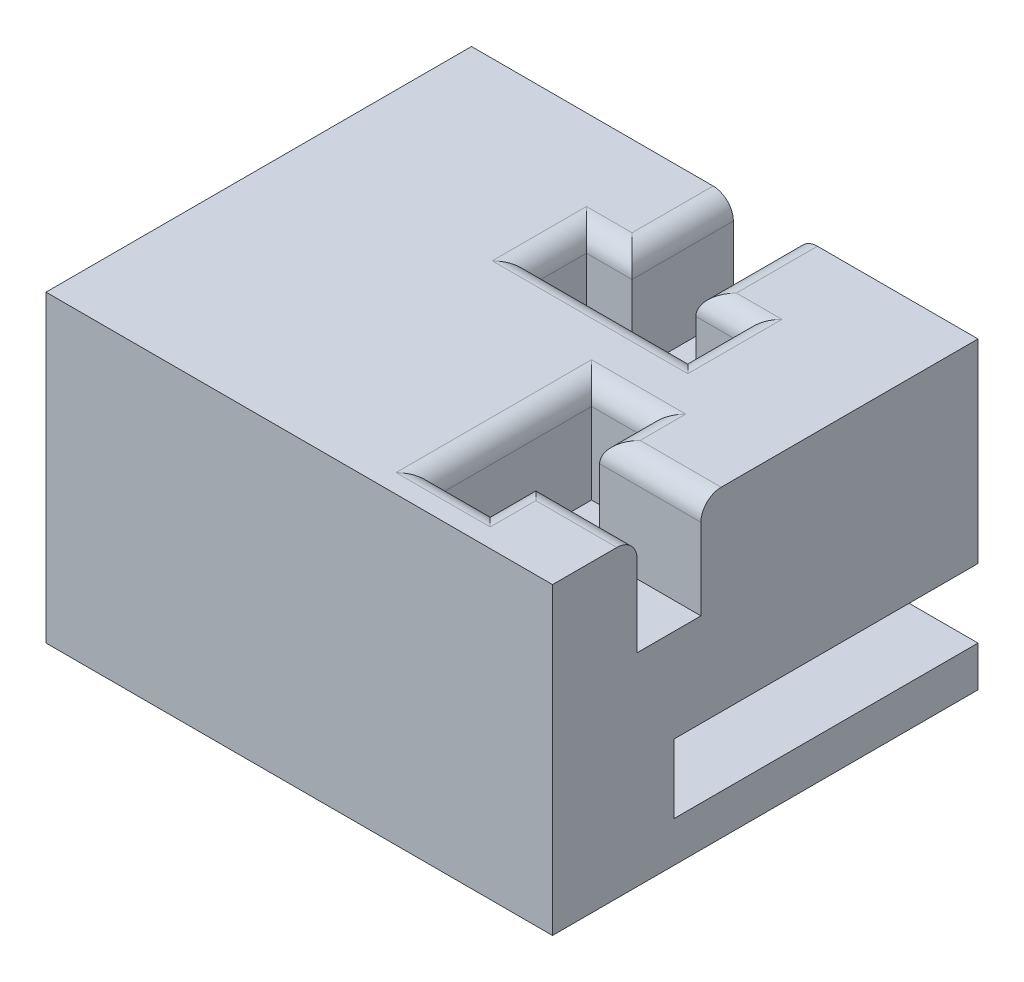
ISO-10303-21;
HEADER;
FILE_DESCRIPTION(('STEP AP214'),'2;1');
FILE_NAME('part.step','',(''),(''),'','','');
FILE_SCHEMA(('AUTOMOTIVE_DESIGN { 1 0 10303 214 1 1 1 1 }'));
ENDSEC;
DATA;
#1=APPLICATION_CONTEXT('core data for automotive mechanical design processes');
#2=APPLICATION_PROTOCOL_DEFINITION('international standard','automotive_design',2000,#1);
#3=PRODUCT_CONTEXT('',#1,'mechanical');
#4=PRODUCT('Part','Part','',(#3));
#5=PRODUCT_RELATED_PRODUCT_CATEGORY('part','',(#4));
#6=PRODUCT_DEFINITION_FORMATION('','',#4);
#7=PRODUCT_DEFINITION_CONTEXT('part definition',#1,'design');
#8=PRODUCT_DEFINITION('design','',#6,#7);
#9=PRODUCT_DEFINITION_SHAPE('','',#8);
#10=(LENGTH_UNIT() NAMED_UNIT(*) SI_UNIT(.MILLI.,.METRE.));
#11=(NAMED_UNIT(*) PLANE_ANGLE_UNIT() SI_UNIT($,.RADIAN.));
#12=(NAMED_UNIT(*) SI_UNIT($,.STERADIAN.) SOLID_ANGLE_UNIT());
#13=UNCERTAINTY_MEASURE_WITH_UNIT(LENGTH_MEASURE(1.E-05),#10,'distance_accuracy_value','');
#14=(GEOMETRIC_REPRESENTATION_CONTEXT(3) GLOBAL_UNCERTAINTY_ASSIGNED_CONTEXT((#13)) GLOBAL_UNIT_ASSIGNED_CONTEXT((#10,
#11,#12)) REPRESENTATION_CONTEXT('',''));
#15=CARTESIAN_POINT('',(0.,0.,0.));
#16=DIRECTION('',(0.,0.,1.));
#17=DIRECTION('',(1.,0.,0.));
#18=AXIS2_PLACEMENT_3D('',#15,#16,#17);
#19=CARTESIAN_POINT('',(-57.5,15.,-10.5));
#20=DIRECTION('',(1.,0.,0.));
#21=DIRECTION('',(0.,0.,1.));
#22=AXIS2_PLACEMENT_3D('',#19,#20,#21);
#23=PLANE('',#22);
#24=DIRECTION('',(0.,0.,-1.));
#25=VECTOR('',#24,1.);
#26=CARTESIAN_POINT('',(-57.5,0.,-10.5));
#27=LINE('',#26,#25);
#28=CARTESIAN_POINT('',(-57.5,0.,10.5));
#29=VERTEX_POINT('',#28);
#30=CARTESIAN_POINT('',(-57.5,0.,-10.5));
#31=VERTEX_POINT('',#30);
#32=EDGE_CURVE('E380',#29,#31,#27,.T.);
#33=ORIENTED_EDGE('',*,*,#32,.F.);
#34=DIRECTION('',(0.,-1.,0.));
#35=VECTOR('',#34,1.);
#36=CARTESIAN_POINT('',(-57.5,15.,10.5));
#37=LINE('',#36,#35);
#38=CARTESIAN_POINT('',(-57.5,15.,10.5));
#39=VERTEX_POINT('',#38);
#40=EDGE_CURVE('E395',#39,#29,#37,.T.);
#41=ORIENTED_EDGE('',*,*,#40,.F.);
#42=DIRECTION('',(0.,0.,-1.));
#43=VECTOR('',#42,1.);
#44=CARTESIAN_POINT('',(-57.5,15.,-10.5));
#45=LINE('',#44,#43);
#46=CARTESIAN_POINT('',(-57.5,15.,-10.5));
#47=VERTEX_POINT('',#46);
#48=EDGE_CURVE('E381',#39,#47,#45,.T.);
#49=ORIENTED_EDGE('',*,*,#48,.T.);
#50=DIRECTION('',(0.,-1.,0.));
#51=VECTOR('',#50,1.);
#52=CARTESIAN_POINT('',(-57.5,15.,-10.5));
#53=LINE('',#52,#51);
#54=EDGE_CURVE('E414',#47,#31,#53,.T.);
#55=ORIENTED_EDGE('',*,*,#54,.T.);
#56=EDGE_LOOP('',(#33,#41,#49,#55));
#57=FACE_BOUND('',#56,.T.);
#58=ADVANCED_FACE('F41',(#57),#23,.F.);
#59=CARTESIAN_POINT('',(-32.5,15.,-10.5));
#60=DIRECTION('',(0.,0.,1.));
#61=DIRECTION('',(-1.,0.,0.));
#62=AXIS2_PLACEMENT_3D('',#59,#60,#61);
#63=PLANE('',#62);
#64=DIRECTION('',(1.,0.,0.));
#65=VECTOR('',#64,1.);
#66=CARTESIAN_POINT('',(-32.5,15.,-10.5));
#67=LINE('',#66,#65);
#68=CARTESIAN_POINT('',(-40.425,15.,-10.5));
#69=VERTEX_POINT('',#68);
#70=CARTESIAN_POINT('',(-32.5,15.,-10.5));
#71=VERTEX_POINT('',#70);
#72=EDGE_CURVE('E384',#69,#71,#67,.T.);
#73=ORIENTED_EDGE('',*,*,#72,.T.);
#74=DIRECTION('',(0.,-1.,0.));
#75=VECTOR('',#74,1.);
#76=CARTESIAN_POINT('',(-32.5,15.,-10.5));
#77=LINE('',#76,#75);
#78=CARTESIAN_POINT('',(-32.5,5.4,-10.5));
#79=VERTEX_POINT('',#78);
#80=EDGE_CURVE('E411',#71,#79,#77,.T.);
#81=ORIENTED_EDGE('',*,*,#80,.T.);
#82=DIRECTION('',(1.,0.,0.));
#83=VECTOR('',#82,1.);
#84=CARTESIAN_POINT('',(-72.8805071437843,5.4,-10.5));
#85=LINE('',#84,#83);
#86=CARTESIAN_POINT('',(-55.1,5.4,-10.5));
#87=VERTEX_POINT('',#86);
#88=EDGE_CURVE('E356',#87,#79,#85,.T.);
#89=ORIENTED_EDGE('',*,*,#88,.F.);
#90=DIRECTION('',(0.,1.,0.));
#91=VECTOR('',#90,1.);
#92=CARTESIAN_POINT('',(-55.1,2.,-10.5));
#93=LINE('',#92,#91);
#94=CARTESIAN_POINT('',(-55.1,2.,-10.5));
#95=VERTEX_POINT('',#94);
#96=EDGE_CURVE('E359',#95,#87,#93,.T.);
#97=ORIENTED_EDGE('',*,*,#96,.F.);
#98=DIRECTION('',(1.,0.,0.));
#99=VECTOR('',#98,1.);
#100=CARTESIAN_POINT('',(-72.8805071437843,2.,-10.5));
#101=LINE('',#100,#99);
#102=CARTESIAN_POINT('',(-32.5,2.,-10.5));
#103=VERTEX_POINT('',#102);
#104=EDGE_CURVE('E370',#95,#103,#101,.T.);
#105=ORIENTED_EDGE('',*,*,#104,.T.);
#106=CARTESIAN_POINT('',(-32.5,0.,-10.5));
#107=VERTEX_POINT('',#106);
#108=EDGE_CURVE('E410',#103,#107,#77,.T.);
#109=ORIENTED_EDGE('',*,*,#108,.T.);
#110=DIRECTION('',(1.,0.,0.));
#111=VECTOR('',#110,1.);
#112=CARTESIAN_POINT('',(-32.5,0.,-10.5));
#113=LINE('',#112,#111);
#114=EDGE_CURVE('E398',#31,#107,#113,.T.);
#115=ORIENTED_EDGE('',*,*,#114,.F.);
#116=ORIENTED_EDGE('',*,*,#54,.F.);
#117=CARTESIAN_POINT('',(-45.575,15.,-10.5));
#118=VERTEX_POINT('',#117);
#119=EDGE_CURVE('E386',#47,#118,#67,.T.);
#120=ORIENTED_EDGE('',*,*,#119,.T.);
#121=CARTESIAN_POINT('',(-45.575,14.,-10.5));
#122=DIRECTION('',(0.,0.,-1.));
#123=DIRECTION('',(-1.,0.,0.));
#124=AXIS2_PLACEMENT_3D('',#121,#122,#123);
#125=CIRCLE('',#124,1.);
#126=CARTESIAN_POINT('',(-44.575,14.,-10.5));
#127=VERTEX_POINT('',#126);
#128=EDGE_CURVE('E458',#127,#118,#125,.F.);
#129=ORIENTED_EDGE('',*,*,#128,.F.);
#130=DIRECTION('',(0.,1.,0.));
#131=VECTOR('',#130,1.);
#132=CARTESIAN_POINT('',(-44.575,10.,-10.5));
#133=LINE('',#132,#131);
#134=CARTESIAN_POINT('',(-44.575,10.,-10.5));
#135=VERTEX_POINT('',#134);
#136=EDGE_CURVE('E336',#135,#127,#133,.T.);
#137=ORIENTED_EDGE('',*,*,#136,.F.);
#138=DIRECTION('',(1.,0.,0.));
#139=VECTOR('',#138,1.);
#140=CARTESIAN_POINT('',(-44.575,10.,-10.5));
#141=LINE('',#140,#139);
#142=CARTESIAN_POINT('',(-41.425,10.,-10.5));
#143=VERTEX_POINT('',#142);
#144=EDGE_CURVE('E279',#135,#143,#141,.T.);
#145=ORIENTED_EDGE('',*,*,#144,.T.);
#146=DIRECTION('',(0.,1.,0.));
#147=VECTOR('',#146,1.);
#148=CARTESIAN_POINT('',(-41.425,10.,-10.5));
#149=LINE('',#148,#147);
#150=CARTESIAN_POINT('',(-41.425,14.,-10.5));
#151=VERTEX_POINT('',#150);
#152=EDGE_CURVE('E314',#143,#151,#149,.T.);
#153=ORIENTED_EDGE('',*,*,#152,.T.);
#154=CARTESIAN_POINT('',(-40.425,14.,-10.5));
#155=DIRECTION('',(0.,0.,-1.));
#156=DIRECTION('',(-1.,0.,0.));
#157=AXIS2_PLACEMENT_3D('',#154,#155,#156);
#158=CIRCLE('',#157,1.);
#159=EDGE_CURVE('E461',#69,#151,#158,.F.);
#160=ORIENTED_EDGE('',*,*,#159,.F.);
#161=EDGE_LOOP('',(#73,#81,#89,#97,#105,#109,#115,#116,#120,#129,#137,#145,#153,#160));
#162=FACE_BOUND('',#161,.T.);
#163=ADVANCED_FACE('F569',(#162),#63,.F.);
#164=CARTESIAN_POINT('',(-32.5,15.,-10.5));
#165=DIRECTION('',(-1.,0.,0.));
#166=DIRECTION('',(0.,0.,-1.));
#167=AXIS2_PLACEMENT_3D('',#164,#165,#166);
#168=PLANE('',#167);
#169=DIRECTION('',(0.,1.,0.));
#170=VECTOR('',#169,1.);
#171=CARTESIAN_POINT('',(-32.5,10.,3.175));
#172=LINE('',#171,#170);
#173=CARTESIAN_POINT('',(-32.5,10.,3.175));
#174=VERTEX_POINT('',#173);
#175=CARTESIAN_POINT('',(-32.5,14.,3.175));
#176=VERTEX_POINT('',#175);
#177=EDGE_CURVE('E310',#174,#176,#172,.T.);
#178=ORIENTED_EDGE('',*,*,#177,.F.);
#179=DIRECTION('',(0.,0.,1.));
#180=VECTOR('',#179,1.);
#181=CARTESIAN_POINT('',(-32.5,10.,6.325));
#182=LINE('',#181,#180);
#183=CARTESIAN_POINT('',(-32.5,10.,6.325));
#184=VERTEX_POINT('',#183);
#185=EDGE_CURVE('E286',#174,#184,#182,.T.);
#186=ORIENTED_EDGE('',*,*,#185,.T.);
#187=DIRECTION('',(0.,1.,0.));
#188=VECTOR('',#187,1.);
#189=CARTESIAN_POINT('',(-32.5,10.,6.325));
#190=LINE('',#189,#188);
#191=CARTESIAN_POINT('',(-32.5,14.,6.325));
#192=VERTEX_POINT('',#191);
#193=EDGE_CURVE('E307',#184,#192,#190,.T.);
#194=ORIENTED_EDGE('',*,*,#193,.T.);
#195=CARTESIAN_POINT('',(-32.5,14.,7.325));
#196=DIRECTION('',(1.,0.,0.));
#197=DIRECTION('',(0.,0.,-1.));
#198=AXIS2_PLACEMENT_3D('',#195,#196,#197);
#199=CIRCLE('',#198,1.);
#200=CARTESIAN_POINT('',(-32.5,15.,7.32499999999999));
#201=VERTEX_POINT('',#200);
#202=EDGE_CURVE('E483',#201,#192,#199,.F.);
#203=ORIENTED_EDGE('',*,*,#202,.F.);
#204=DIRECTION('',(0.,0.,1.));
#205=VECTOR('',#204,1.);
#206=CARTESIAN_POINT('',(-32.5,15.,-10.5));
#207=LINE('',#206,#205);
#208=CARTESIAN_POINT('',(-32.5,15.,10.5));
#209=VERTEX_POINT('',#208);
#210=EDGE_CURVE('E389',#201,#209,#207,.T.);
#211=ORIENTED_EDGE('',*,*,#210,.T.);
#212=DIRECTION('',(0.,-1.,0.));
#213=VECTOR('',#212,1.);
#214=CARTESIAN_POINT('',(-32.5,15.,10.5));
#215=LINE('',#214,#213);
#216=CARTESIAN_POINT('',(-32.5,0.,10.5));
#217=VERTEX_POINT('',#216);
#218=EDGE_CURVE('E407',#209,#217,#215,.T.);
#219=ORIENTED_EDGE('',*,*,#218,.T.);
#220=DIRECTION('',(0.,0.,1.));
#221=VECTOR('',#220,1.);
#222=CARTESIAN_POINT('',(-32.5,0.,-10.5));
#223=LINE('',#222,#221);
#224=EDGE_CURVE('E401',#107,#217,#223,.T.);
#225=ORIENTED_EDGE('',*,*,#224,.F.);
#226=ORIENTED_EDGE('',*,*,#108,.F.);
#227=DIRECTION('',(0.,0.,1.));
#228=VECTOR('',#227,1.);
#229=CARTESIAN_POINT('',(-32.5,2.,-10.5));
#230=LINE('',#229,#228);
#231=CARTESIAN_POINT('',(-32.5,2.,4.5));
#232=VERTEX_POINT('',#231);
#233=EDGE_CURVE('E297',#103,#232,#230,.T.);
#234=ORIENTED_EDGE('',*,*,#233,.T.);
#235=DIRECTION('',(0.,1.,0.));
#236=VECTOR('',#235,1.);
#237=CARTESIAN_POINT('',(-32.5,2.,4.5));
#238=LINE('',#237,#236);
#239=CARTESIAN_POINT('',(-32.5,5.4,4.5));
#240=VERTEX_POINT('',#239);
#241=EDGE_CURVE('E365',#232,#240,#238,.T.);
#242=ORIENTED_EDGE('',*,*,#241,.T.);
#243=DIRECTION('',(0.,0.,-1.));
#244=VECTOR('',#243,1.);
#245=CARTESIAN_POINT('',(-32.5,5.4,-10.5));
#246=LINE('',#245,#244);
#247=EDGE_CURVE('E368',#240,#79,#246,.T.);
#248=ORIENTED_EDGE('',*,*,#247,.T.);
#249=ORIENTED_EDGE('',*,*,#80,.F.);
#250=CARTESIAN_POINT('',(-32.5,15.,2.175));
#251=VERTEX_POINT('',#250);
#252=EDGE_CURVE('E390',#71,#251,#207,.T.);
#253=ORIENTED_EDGE('',*,*,#252,.T.);
#254=CARTESIAN_POINT('',(-32.5,14.,2.175));
#255=DIRECTION('',(1.,0.,0.));
#256=DIRECTION('',(0.,0.,-1.));
#257=AXIS2_PLACEMENT_3D('',#254,#255,#256);
#258=CIRCLE('',#257,1.);
#259=EDGE_CURVE('E486',#176,#251,#258,.F.);
#260=ORIENTED_EDGE('',*,*,#259,.F.);
#261=EDGE_LOOP('',(#178,#186,#194,#203,#211,#219,#225,#226,#234,#242,#248,#249,#253,#260));
#262=FACE_BOUND('',#261,.T.);
#263=ADVANCED_FACE('F532',(#262),#168,.F.);
#264=CARTESIAN_POINT('',(-32.5,15.,10.5));
#265=DIRECTION('',(0.,0.,-1.));
#266=DIRECTION('',(1.,0.,0.));
#267=AXIS2_PLACEMENT_3D('',#264,#265,#266);
#268=PLANE('',#267);
#269=DIRECTION('',(-1.,0.,0.));
#270=VECTOR('',#269,1.);
#271=CARTESIAN_POINT('',(-32.5,0.,10.5));
#272=LINE('',#271,#270);
#273=EDGE_CURVE('E385',#217,#29,#272,.T.);
#274=ORIENTED_EDGE('',*,*,#273,.F.);
#275=ORIENTED_EDGE('',*,*,#218,.F.);
#276=DIRECTION('',(-1.,0.,0.));
#277=VECTOR('',#276,1.);
#278=CARTESIAN_POINT('',(-32.5,15.,10.5));
#279=LINE('',#278,#277);
#280=EDGE_CURVE('E393',#209,#39,#279,.T.);
#281=ORIENTED_EDGE('',*,*,#280,.T.);
#282=ORIENTED_EDGE('',*,*,#40,.T.);
#283=EDGE_LOOP('',(#274,#275,#281,#282));
#284=FACE_BOUND('',#283,.T.);
#285=ADVANCED_FACE('F603',(#284),#268,.F.);
#286=CARTESIAN_POINT('',(-45.,15.,0.));
#287=DIRECTION('',(0.,1.,0.));
#288=DIRECTION('',(0.,0.,1.));
#289=AXIS2_PLACEMENT_3D('',#286,#287,#288);
#290=PLANE('',#289);
#291=DIRECTION('',(1.,0.,0.));
#292=VECTOR('',#291,1.);
#293=CARTESIAN_POINT('',(-41.425,15.,-6.5));
#294=LINE('',#293,#292);
#295=CARTESIAN_POINT('',(-38.175,15.,-6.5));
#296=VERTEX_POINT('',#295);
#297=CARTESIAN_POINT('',(-40.425,15.,-6.5));
#298=VERTEX_POINT('',#297);
#299=EDGE_CURVE('E453',#296,#298,#294,.F.);
#300=ORIENTED_EDGE('',*,*,#299,.F.);
#301=DIRECTION('',(0.,0.,1.));
#302=VECTOR('',#301,1.);
#303=CARTESIAN_POINT('',(-38.175,15.,-5.5));
#304=LINE('',#303,#302);
#305=CARTESIAN_POINT('',(-38.175,15.,-1.85));
#306=VERTEX_POINT('',#305);
#307=EDGE_CURVE('E450',#306,#296,#304,.F.);
#308=ORIENTED_EDGE('',*,*,#307,.F.);
#309=DIRECTION('',(-1.,0.,0.));
#310=VECTOR('',#309,1.);
#311=CARTESIAN_POINT('',(-39.175,15.,-1.85));
#312=LINE('',#311,#310);
#313=CARTESIAN_POINT('',(-47.825,15.,-1.85));
#314=VERTEX_POINT('',#313);
#315=EDGE_CURVE('E447',#314,#306,#312,.F.);
#316=ORIENTED_EDGE('',*,*,#315,.F.);
#317=DIRECTION('',(0.,0.,-1.));
#318=VECTOR('',#317,1.);
#319=CARTESIAN_POINT('',(-47.825,15.,-2.85));
#320=LINE('',#319,#318);
#321=CARTESIAN_POINT('',(-47.825,15.,-6.5));
#322=VERTEX_POINT('',#321);
#323=EDGE_CURVE('E444',#322,#314,#320,.F.);
#324=ORIENTED_EDGE('',*,*,#323,.F.);
#325=DIRECTION('',(1.,0.,0.));
#326=VECTOR('',#325,1.);
#327=CARTESIAN_POINT('',(-46.825,15.,-6.5));
#328=LINE('',#327,#326);
#329=CARTESIAN_POINT('',(-45.575,15.,-6.5));
#330=VERTEX_POINT('',#329);
#331=EDGE_CURVE('E441',#330,#322,#328,.F.);
#332=ORIENTED_EDGE('',*,*,#331,.F.);
#333=DIRECTION('',(0.,0.,-1.));
#334=VECTOR('',#333,1.);
#335=CARTESIAN_POINT('',(-45.575,15.,-5.5));
#336=LINE('',#335,#334);
#337=EDGE_CURVE('E438',#118,#330,#336,.F.);
#338=ORIENTED_EDGE('',*,*,#337,.F.);
#339=ORIENTED_EDGE('',*,*,#119,.F.);
#340=ORIENTED_EDGE('',*,*,#48,.F.);
#341=ORIENTED_EDGE('',*,*,#280,.F.);
#342=ORIENTED_EDGE('',*,*,#210,.F.);
#343=DIRECTION('',(-1.,0.,0.));
#344=VECTOR('',#343,1.);
#345=CARTESIAN_POINT('',(-32.5,15.,7.325));
#346=LINE('',#345,#344);
#347=CARTESIAN_POINT('',(-36.5,15.,7.325));
#348=VERTEX_POINT('',#347);
#349=EDGE_CURVE('E420',#348,#201,#346,.F.);
#350=ORIENTED_EDGE('',*,*,#349,.F.);
#351=DIRECTION('',(0.,0.,1.));
#352=VECTOR('',#351,1.);
#353=CARTESIAN_POINT('',(-36.5,15.,6.325));
#354=LINE('',#353,#352);
#355=CARTESIAN_POINT('',(-36.5,15.,9.575));
#356=VERTEX_POINT('',#355);
#357=EDGE_CURVE('E422',#356,#348,#354,.F.);
#358=ORIENTED_EDGE('',*,*,#357,.F.);
#359=DIRECTION('',(-1.,0.,0.));
#360=VECTOR('',#359,1.);
#361=CARTESIAN_POINT('',(-37.5,15.,9.575));
#362=LINE('',#361,#360);
#363=CARTESIAN_POINT('',(-41.15,15.,9.575));
#364=VERTEX_POINT('',#363);
#365=EDGE_CURVE('E424',#364,#356,#362,.F.);
#366=ORIENTED_EDGE('',*,*,#365,.F.);
#367=DIRECTION('',(0.,0.,-1.));
#368=VECTOR('',#367,1.);
#369=CARTESIAN_POINT('',(-41.15,15.,8.575));
#370=LINE('',#369,#368);
#371=CARTESIAN_POINT('',(-41.15,15.,-0.0749999999999995));
#372=VERTEX_POINT('',#371);
#373=EDGE_CURVE('E426',#372,#364,#370,.F.);
#374=ORIENTED_EDGE('',*,*,#373,.F.);
#375=DIRECTION('',(1.,0.,0.));
#376=VECTOR('',#375,1.);
#377=CARTESIAN_POINT('',(-40.15,15.,-0.0749999999999995));
#378=LINE('',#377,#376);
#379=CARTESIAN_POINT('',(-36.5,15.,-0.0749999999999995));
#380=VERTEX_POINT('',#379);
#381=EDGE_CURVE('E429',#380,#372,#378,.F.);
#382=ORIENTED_EDGE('',*,*,#381,.F.);
#383=DIRECTION('',(0.,0.,1.));
#384=VECTOR('',#383,1.);
#385=CARTESIAN_POINT('',(-36.5,15.,0.925));
#386=LINE('',#385,#384);
#387=CARTESIAN_POINT('',(-36.5,15.,2.175));
#388=VERTEX_POINT('',#387);
#389=EDGE_CURVE('E432',#388,#380,#386,.F.);
#390=ORIENTED_EDGE('',*,*,#389,.F.);
#391=DIRECTION('',(1.,0.,0.));
#392=VECTOR('',#391,1.);
#393=CARTESIAN_POINT('',(-37.5,15.,2.175));
#394=LINE('',#393,#392);
#395=EDGE_CURVE('E435',#251,#388,#394,.F.);
#396=ORIENTED_EDGE('',*,*,#395,.F.);
#397=ORIENTED_EDGE('',*,*,#252,.F.);
#398=ORIENTED_EDGE('',*,*,#72,.F.);
#399=DIRECTION('',(0.,0.,1.));
#400=VECTOR('',#399,1.);
#401=CARTESIAN_POINT('',(-40.425,15.,-10.5));
#402=LINE('',#401,#400);
#403=EDGE_CURVE('E456',#298,#69,#402,.F.);
#404=ORIENTED_EDGE('',*,*,#403,.F.);
#405=EDGE_LOOP('',(#300,#308,#316,#324,#332,#338,#339,#340,#341,#342,#350,#358,#366,#374,#382,
#390,#396,#397,#398,#404));
#406=FACE_BOUND('',#405,.T.);
#407=ADVANCED_FACE('F525',(#406),#290,.T.);
#408=CARTESIAN_POINT('',(-45.,0.,0.));
#409=DIRECTION('',(0.,1.,0.));
#410=DIRECTION('',(0.,0.,1.));
#411=AXIS2_PLACEMENT_3D('',#408,#409,#410);
#412=PLANE('',#411);
#413=ORIENTED_EDGE('',*,*,#32,.T.);
#414=ORIENTED_EDGE('',*,*,#114,.T.);
#415=ORIENTED_EDGE('',*,*,#224,.T.);
#416=ORIENTED_EDGE('',*,*,#273,.T.);
#417=EDGE_LOOP('',(#413,#414,#415,#416));
#418=FACE_BOUND('',#417,.T.);
#419=ADVANCED_FACE('F607',(#418),#412,.F.);
#420=CARTESIAN_POINT('',(-72.8805071437843,5.4,-10.5));
#421=DIRECTION('',(0.,1.,0.));
#422=DIRECTION('',(0.,0.,1.));
#423=AXIS2_PLACEMENT_3D('',#420,#421,#422);
#424=PLANE('',#423);
#425=DIRECTION('',(0.,0.,1.));
#426=VECTOR('',#425,1.);
#427=CARTESIAN_POINT('',(-55.1,5.4,-10.5));
#428=LINE('',#427,#426);
#429=CARTESIAN_POINT('',(-55.1,5.4,4.5));
#430=VERTEX_POINT('',#429);
#431=EDGE_CURVE('E355',#87,#430,#428,.T.);
#432=ORIENTED_EDGE('',*,*,#431,.F.);
#433=ORIENTED_EDGE('',*,*,#88,.T.);
#434=ORIENTED_EDGE('',*,*,#247,.F.);
#435=DIRECTION('',(1.,0.,0.));
#436=VECTOR('',#435,1.);
#437=CARTESIAN_POINT('',(-72.8805071437843,5.4,4.5));
#438=LINE('',#437,#436);
#439=EDGE_CURVE('E373',#430,#240,#438,.T.);
#440=ORIENTED_EDGE('',*,*,#439,.F.);
#441=EDGE_LOOP('',(#432,#433,#434,#440));
#442=FACE_BOUND('',#441,.T.);
#443=ADVANCED_FACE('F619',(#442),#424,.F.);
#444=CARTESIAN_POINT('',(-72.8805071437843,2.,4.5));
#445=DIRECTION('',(0.,0.,1.));
#446=DIRECTION('',(0.,-1.,0.));
#447=AXIS2_PLACEMENT_3D('',#444,#445,#446);
#448=PLANE('',#447);
#449=DIRECTION('',(0.,-1.,0.));
#450=VECTOR('',#449,1.);
#451=CARTESIAN_POINT('',(-55.1,2.,4.5));
#452=LINE('',#451,#450);
#453=CARTESIAN_POINT('',(-55.1,2.,4.5));
#454=VERTEX_POINT('',#453);
#455=EDGE_CURVE('E352',#430,#454,#452,.T.);
#456=ORIENTED_EDGE('',*,*,#455,.F.);
#457=ORIENTED_EDGE('',*,*,#439,.T.);
#458=ORIENTED_EDGE('',*,*,#241,.F.);
#459=DIRECTION('',(1.,0.,0.));
#460=VECTOR('',#459,1.);
#461=CARTESIAN_POINT('',(-72.8805071437843,2.,4.5));
#462=LINE('',#461,#460);
#463=EDGE_CURVE('E375',#454,#232,#462,.T.);
#464=ORIENTED_EDGE('',*,*,#463,.F.);
#465=EDGE_LOOP('',(#456,#457,#458,#464));
#466=FACE_BOUND('',#465,.T.);
#467=ADVANCED_FACE('F616',(#466),#448,.F.);
#468=CARTESIAN_POINT('',(-72.8805071437843,2.,-10.5));
#469=DIRECTION('',(0.,-1.,0.));
#470=DIRECTION('',(0.,0.,-1.));
#471=AXIS2_PLACEMENT_3D('',#468,#469,#470);
#472=PLANE('',#471);
#473=DIRECTION('',(0.,0.,-1.));
#474=VECTOR('',#473,1.);
#475=CARTESIAN_POINT('',(-55.1,2.,-10.5));
#476=LINE('',#475,#474);
#477=EDGE_CURVE('E362',#454,#95,#476,.T.);
#478=ORIENTED_EDGE('',*,*,#477,.F.);
#479=ORIENTED_EDGE('',*,*,#463,.T.);
#480=ORIENTED_EDGE('',*,*,#233,.F.);
#481=ORIENTED_EDGE('',*,*,#104,.F.);
#482=EDGE_LOOP('',(#478,#479,#480,#481));
#483=FACE_BOUND('',#482,.T.);
#484=ADVANCED_FACE('F611',(#483),#472,.F.);
#485=CARTESIAN_POINT('',(-55.1,15.,-10.5));
#486=DIRECTION('',(1.,0.,0.));
#487=DIRECTION('',(0.,0.,1.));
#488=AXIS2_PLACEMENT_3D('',#485,#486,#487);
#489=PLANE('',#488);
#490=ORIENTED_EDGE('',*,*,#96,.T.);
#491=ORIENTED_EDGE('',*,*,#431,.T.);
#492=ORIENTED_EDGE('',*,*,#455,.T.);
#493=ORIENTED_EDGE('',*,*,#477,.T.);
#494=EDGE_LOOP('',(#490,#491,#492,#493));
#495=FACE_BOUND('',#494,.T.);
#496=ADVANCED_FACE('F621',(#495),#489,.T.);
#497=CARTESIAN_POINT('',(-44.575,10.,-5.5));
#498=DIRECTION('',(-1.,0.,0.));
#499=DIRECTION('',(0.,0.,-1.));
#500=AXIS2_PLACEMENT_3D('',#497,#498,#499);
#501=PLANE('',#500);
#502=DIRECTION('',(0.,1.,0.));
#503=VECTOR('',#502,1.);
#504=CARTESIAN_POINT('',(-44.575,10.,-5.5));
#505=LINE('',#504,#503);
#506=CARTESIAN_POINT('',(-44.575,10.,-5.5));
#507=VERTEX_POINT('',#506);
#508=CARTESIAN_POINT('',(-44.575,14.,-5.5));
#509=VERTEX_POINT('',#508);
#510=EDGE_CURVE('E333',#507,#509,#505,.T.);
#511=ORIENTED_EDGE('',*,*,#510,.F.);
#512=DIRECTION('',(0.,0.,-1.));
#513=VECTOR('',#512,1.);
#514=CARTESIAN_POINT('',(-44.575,10.,-5.5));
#515=LINE('',#514,#513);
#516=EDGE_CURVE('E317',#507,#135,#515,.T.);
#517=ORIENTED_EDGE('',*,*,#516,.T.);
#518=ORIENTED_EDGE('',*,*,#136,.T.);
#519=DIRECTION('',(0.,0.,-1.));
#520=VECTOR('',#519,1.);
#521=CARTESIAN_POINT('',(-44.575,14.,-10.5));
#522=LINE('',#521,#520);
#523=EDGE_CURVE('E479',#509,#127,#522,.T.);
#524=ORIENTED_EDGE('',*,*,#523,.F.);
#525=EDGE_LOOP('',(#511,#517,#518,#524));
#526=FACE_BOUND('',#525,.T.);
#527=ADVANCED_FACE('F623',(#526),#501,.F.);
#528=CARTESIAN_POINT('',(-46.825,10.,-5.5));
#529=DIRECTION('',(0.,0.,-1.));
#530=DIRECTION('',(1.,0.,0.));
#531=AXIS2_PLACEMENT_3D('',#528,#529,#530);
#532=PLANE('',#531);
#533=DIRECTION('',(0.,1.,0.));
#534=VECTOR('',#533,1.);
#535=CARTESIAN_POINT('',(-46.825,10.,-5.5));
#536=LINE('',#535,#534);
#537=CARTESIAN_POINT('',(-46.825,10.,-5.5));
#538=VERTEX_POINT('',#537);
#539=CARTESIAN_POINT('',(-46.825,14.,-5.5));
#540=VERTEX_POINT('',#539);
#541=EDGE_CURVE('E330',#538,#540,#536,.T.);
#542=ORIENTED_EDGE('',*,*,#541,.F.);
#543=DIRECTION('',(1.,0.,0.));
#544=VECTOR('',#543,1.);
#545=CARTESIAN_POINT('',(-46.825,10.,-5.5));
#546=LINE('',#545,#544);
#547=EDGE_CURVE('E341',#538,#507,#546,.T.);
#548=ORIENTED_EDGE('',*,*,#547,.T.);
#549=ORIENTED_EDGE('',*,*,#510,.T.);
#550=DIRECTION('',(1.,0.,0.));
#551=VECTOR('',#550,1.);
#552=CARTESIAN_POINT('',(-44.575,14.,-5.5));
#553=LINE('',#552,#551);
#554=EDGE_CURVE('E476',#540,#509,#553,.T.);
#555=ORIENTED_EDGE('',*,*,#554,.F.);
#556=EDGE_LOOP('',(#542,#548,#549,#555));
#557=FACE_BOUND('',#556,.T.);
#558=ADVANCED_FACE('F629',(#557),#532,.F.);
#559=CARTESIAN_POINT('',(-46.825,10.,-2.85));
#560=DIRECTION('',(-1.,0.,0.));
#561=DIRECTION('',(0.,0.,-1.));
#562=AXIS2_PLACEMENT_3D('',#559,#560,#561);
#563=PLANE('',#562);
#564=DIRECTION('',(0.,1.,0.));
#565=VECTOR('',#564,1.);
#566=CARTESIAN_POINT('',(-46.825,10.,-2.85));
#567=LINE('',#566,#565);
#568=CARTESIAN_POINT('',(-46.825,10.,-2.85));
#569=VERTEX_POINT('',#568);
#570=CARTESIAN_POINT('',(-46.825,14.,-2.85));
#571=VERTEX_POINT('',#570);
#572=EDGE_CURVE('E327',#569,#571,#567,.T.);
#573=ORIENTED_EDGE('',*,*,#572,.F.);
#574=DIRECTION('',(0.,0.,-1.));
#575=VECTOR('',#574,1.);
#576=CARTESIAN_POINT('',(-46.825,10.,-2.85));
#577=LINE('',#576,#575);
#578=EDGE_CURVE('E343',#569,#538,#577,.T.);
#579=ORIENTED_EDGE('',*,*,#578,.T.);
#580=ORIENTED_EDGE('',*,*,#541,.T.);
#581=DIRECTION('',(0.,0.,-1.));
#582=VECTOR('',#581,1.);
#583=CARTESIAN_POINT('',(-46.825,14.,-5.5));
#584=LINE('',#583,#582);
#585=EDGE_CURVE('E473',#571,#540,#584,.T.);
#586=ORIENTED_EDGE('',*,*,#585,.F.);
#587=EDGE_LOOP('',(#573,#579,#580,#586));
#588=FACE_BOUND('',#587,.T.);
#589=ADVANCED_FACE('F808',(#588),#563,.F.);
#590=CARTESIAN_POINT('',(-39.175,10.,-2.85));
#591=DIRECTION('',(0.,0.,1.));
#592=DIRECTION('',(-1.,0.,0.));
#593=AXIS2_PLACEMENT_3D('',#590,#591,#592);
#594=PLANE('',#593);
#595=DIRECTION('',(0.,1.,0.));
#596=VECTOR('',#595,1.);
#597=CARTESIAN_POINT('',(-39.175,10.,-2.85));
#598=LINE('',#597,#596);
#599=CARTESIAN_POINT('',(-39.175,10.,-2.85));
#600=VERTEX_POINT('',#599);
#601=CARTESIAN_POINT('',(-39.175,14.,-2.85));
#602=VERTEX_POINT('',#601);
#603=EDGE_CURVE('E324',#600,#602,#598,.T.);
#604=ORIENTED_EDGE('',*,*,#603,.F.);
#605=DIRECTION('',(-1.,0.,0.));
#606=VECTOR('',#605,1.);
#607=CARTESIAN_POINT('',(-39.175,10.,-2.85));
#608=LINE('',#607,#606);
#609=EDGE_CURVE('E345',#600,#569,#608,.T.);
#610=ORIENTED_EDGE('',*,*,#609,.T.);
#611=ORIENTED_EDGE('',*,*,#572,.T.);
#612=DIRECTION('',(-1.,0.,0.));
#613=VECTOR('',#612,1.);
#614=CARTESIAN_POINT('',(-46.825,14.,-2.85));
#615=LINE('',#614,#613);
#616=EDGE_CURVE('E470',#602,#571,#615,.T.);
#617=ORIENTED_EDGE('',*,*,#616,.F.);
#618=EDGE_LOOP('',(#604,#610,#611,#617));
#619=FACE_BOUND('',#618,.T.);
#620=ADVANCED_FACE('F799',(#619),#594,.F.);
#621=CARTESIAN_POINT('',(-39.175,10.,-5.5));
#622=DIRECTION('',(1.,0.,0.));
#623=DIRECTION('',(0.,0.,1.));
#624=AXIS2_PLACEMENT_3D('',#621,#622,#623);
#625=PLANE('',#624);
#626=DIRECTION('',(0.,1.,0.));
#627=VECTOR('',#626,1.);
#628=CARTESIAN_POINT('',(-39.175,10.,-5.5));
#629=LINE('',#628,#627);
#630=CARTESIAN_POINT('',(-39.175,10.,-5.5));
#631=VERTEX_POINT('',#630);
#632=CARTESIAN_POINT('',(-39.175,14.,-5.5));
#633=VERTEX_POINT('',#632);
#634=EDGE_CURVE('E321',#631,#633,#629,.T.);
#635=ORIENTED_EDGE('',*,*,#634,.F.);
#636=DIRECTION('',(0.,0.,1.));
#637=VECTOR('',#636,1.);
#638=CARTESIAN_POINT('',(-39.175,10.,-5.5));
#639=LINE('',#638,#637);
#640=EDGE_CURVE('E347',#631,#600,#639,.T.);
#641=ORIENTED_EDGE('',*,*,#640,.T.);
#642=ORIENTED_EDGE('',*,*,#603,.T.);
#643=DIRECTION('',(0.,0.,1.));
#644=VECTOR('',#643,1.);
#645=CARTESIAN_POINT('',(-39.175,14.,-2.85));
#646=LINE('',#645,#644);
#647=EDGE_CURVE('E467',#633,#602,#646,.T.);
#648=ORIENTED_EDGE('',*,*,#647,.F.);
#649=EDGE_LOOP('',(#635,#641,#642,#648));
#650=FACE_BOUND('',#649,.T.);
#651=ADVANCED_FACE('F790',(#650),#625,.F.);
#652=CARTESIAN_POINT('',(-41.425,10.,-5.5));
#653=DIRECTION('',(0.,0.,-1.));
#654=DIRECTION('',(1.,0.,0.));
#655=AXIS2_PLACEMENT_3D('',#652,#653,#654);
#656=PLANE('',#655);
#657=DIRECTION('',(0.,1.,0.));
#658=VECTOR('',#657,1.);
#659=CARTESIAN_POINT('',(-41.425,10.,-5.5));
#660=LINE('',#659,#658);
#661=CARTESIAN_POINT('',(-41.425,10.,-5.5));
#662=VERTEX_POINT('',#661);
#663=CARTESIAN_POINT('',(-41.425,14.,-5.5));
#664=VERTEX_POINT('',#663);
#665=EDGE_CURVE('E318',#662,#664,#660,.T.);
#666=ORIENTED_EDGE('',*,*,#665,.F.);
#667=DIRECTION('',(1.,0.,0.));
#668=VECTOR('',#667,1.);
#669=CARTESIAN_POINT('',(-41.425,10.,-5.5));
#670=LINE('',#669,#668);
#671=EDGE_CURVE('E349',#662,#631,#670,.T.);
#672=ORIENTED_EDGE('',*,*,#671,.T.);
#673=ORIENTED_EDGE('',*,*,#634,.T.);
#674=DIRECTION('',(1.,0.,0.));
#675=VECTOR('',#674,1.);
#676=CARTESIAN_POINT('',(-39.175,14.,-5.5));
#677=LINE('',#676,#675);
#678=EDGE_CURVE('E464',#664,#633,#677,.T.);
#679=ORIENTED_EDGE('',*,*,#678,.F.);
#680=EDGE_LOOP('',(#666,#672,#673,#679));
#681=FACE_BOUND('',#680,.T.);
#682=ADVANCED_FACE('F781',(#681),#656,.F.);
#683=CARTESIAN_POINT('',(-41.425,10.,-10.5));
#684=DIRECTION('',(1.,0.,0.));
#685=DIRECTION('',(0.,0.,1.));
#686=AXIS2_PLACEMENT_3D('',#683,#684,#685);
#687=PLANE('',#686);
#688=ORIENTED_EDGE('',*,*,#152,.F.);
#689=DIRECTION('',(0.,0.,1.));
#690=VECTOR('',#689,1.);
#691=CARTESIAN_POINT('',(-41.425,10.,-10.5));
#692=LINE('',#691,#690);
#693=EDGE_CURVE('E282',#143,#662,#692,.T.);
#694=ORIENTED_EDGE('',*,*,#693,.T.);
#695=ORIENTED_EDGE('',*,*,#665,.T.);
#696=DIRECTION('',(0.,0.,1.));
#697=VECTOR('',#696,1.);
#698=CARTESIAN_POINT('',(-41.425,14.,-5.5));
#699=LINE('',#698,#697);
#700=EDGE_CURVE('E417',#151,#664,#699,.T.);
#701=ORIENTED_EDGE('',*,*,#700,.F.);
#702=EDGE_LOOP('',(#688,#694,#695,#701));
#703=FACE_BOUND('',#702,.T.);
#704=ADVANCED_FACE('F773',(#703),#687,.F.);
#705=CARTESIAN_POINT('',(-45.,10.,0.));
#706=DIRECTION('',(0.,1.,0.));
#707=DIRECTION('',(0.,0.,1.));
#708=AXIS2_PLACEMENT_3D('',#705,#706,#707);
#709=PLANE('',#708);
#710=ORIENTED_EDGE('',*,*,#144,.F.);
#711=ORIENTED_EDGE('',*,*,#516,.F.);
#712=ORIENTED_EDGE('',*,*,#547,.F.);
#713=ORIENTED_EDGE('',*,*,#578,.F.);
#714=ORIENTED_EDGE('',*,*,#609,.F.);
#715=ORIENTED_EDGE('',*,*,#640,.F.);
#716=ORIENTED_EDGE('',*,*,#671,.F.);
#717=ORIENTED_EDGE('',*,*,#693,.F.);
#718=EDGE_LOOP('',(#710,#711,#712,#713,#714,#715,#716,#717));
#719=FACE_BOUND('',#718,.T.);
#720=ADVANCED_FACE('F765',(#719),#709,.T.);
#721=CARTESIAN_POINT('',(-37.5,10.,0.925));
#722=DIRECTION('',(0.,0.,-1.));
#723=DIRECTION('',(1.,0.,0.));
#724=AXIS2_PLACEMENT_3D('',#721,#722,#723);
#725=PLANE('',#724);
#726=DIRECTION('',(0.,1.,0.));
#727=VECTOR('',#726,1.);
#728=CARTESIAN_POINT('',(-40.15,10.,0.925));
#729=LINE('',#728,#727);
#730=CARTESIAN_POINT('',(-40.15,10.,0.925));
#731=VERTEX_POINT('',#730);
#732=CARTESIAN_POINT('',(-40.15,14.,0.925));
#733=VERTEX_POINT('',#732);
#734=EDGE_CURVE('E278',#731,#733,#729,.T.);
#735=ORIENTED_EDGE('',*,*,#734,.F.);
#736=DIRECTION('',(1.,0.,0.));
#737=VECTOR('',#736,1.);
#738=CARTESIAN_POINT('',(-37.5,10.,0.925));
#739=LINE('',#738,#737);
#740=CARTESIAN_POINT('',(-37.5,10.,0.925));
#741=VERTEX_POINT('',#740);
#742=EDGE_CURVE('E256',#731,#741,#739,.T.);
#743=ORIENTED_EDGE('',*,*,#742,.T.);
#744=DIRECTION('',(0.,1.,0.));
#745=VECTOR('',#744,1.);
#746=CARTESIAN_POINT('',(-37.5,10.,0.925));
#747=LINE('',#746,#745);
#748=CARTESIAN_POINT('',(-37.5,14.,0.925));
#749=VERTEX_POINT('',#748);
#750=EDGE_CURVE('E266',#741,#749,#747,.T.);
#751=ORIENTED_EDGE('',*,*,#750,.T.);
#752=DIRECTION('',(1.,0.,0.));
#753=VECTOR('',#752,1.);
#754=CARTESIAN_POINT('',(-37.5,14.,0.925));
#755=LINE('',#754,#753);
#756=EDGE_CURVE('E490',#733,#749,#755,.T.);
#757=ORIENTED_EDGE('',*,*,#756,.F.);
#758=EDGE_LOOP('',(#735,#743,#751,#757));
#759=FACE_BOUND('',#758,.T.);
#760=ADVANCED_FACE('F276',(#759),#725,.F.);
#761=CARTESIAN_POINT('',(-40.15,10.,0.925));
#762=DIRECTION('',(-1.,0.,0.));
#763=DIRECTION('',(0.,0.,-1.));
#764=AXIS2_PLACEMENT_3D('',#761,#762,#763);
#765=PLANE('',#764);
#766=DIRECTION('',(0.,1.,0.));
#767=VECTOR('',#766,1.);
#768=CARTESIAN_POINT('',(-40.15,10.,8.575));
#769=LINE('',#768,#767);
#770=CARTESIAN_POINT('',(-40.15,10.,8.575));
#771=VERTEX_POINT('',#770);
#772=CARTESIAN_POINT('',(-40.15,14.,8.575));
#773=VERTEX_POINT('',#772);
#774=EDGE_CURVE('E298',#771,#773,#769,.T.);
#775=ORIENTED_EDGE('',*,*,#774,.F.);
#776=DIRECTION('',(0.,0.,-1.));
#777=VECTOR('',#776,1.);
#778=CARTESIAN_POINT('',(-40.15,10.,0.925));
#779=LINE('',#778,#777);
#780=EDGE_CURVE('E274',#771,#731,#779,.T.);
#781=ORIENTED_EDGE('',*,*,#780,.T.);
#782=ORIENTED_EDGE('',*,*,#734,.T.);
#783=DIRECTION('',(0.,0.,-1.));
#784=VECTOR('',#783,1.);
#785=CARTESIAN_POINT('',(-40.15,14.,0.925));
#786=LINE('',#785,#784);
#787=EDGE_CURVE('E492',#773,#733,#786,.T.);
#788=ORIENTED_EDGE('',*,*,#787,.F.);
#789=EDGE_LOOP('',(#775,#781,#782,#788));
#790=FACE_BOUND('',#789,.T.);
#791=ADVANCED_FACE('F549',(#790),#765,.F.);
#792=CARTESIAN_POINT('',(-40.15,10.,8.575));
#793=DIRECTION('',(0.,0.,1.));
#794=DIRECTION('',(-1.,0.,0.));
#795=AXIS2_PLACEMENT_3D('',#792,#793,#794);
#796=PLANE('',#795);
#797=DIRECTION('',(0.,1.,0.));
#798=VECTOR('',#797,1.);
#799=CARTESIAN_POINT('',(-37.5,10.,8.575));
#800=LINE('',#799,#798);
#801=CARTESIAN_POINT('',(-37.5,10.,8.575));
#802=VERTEX_POINT('',#801);
#803=CARTESIAN_POINT('',(-37.5,14.,8.575));
#804=VERTEX_POINT('',#803);
#805=EDGE_CURVE('E301',#802,#804,#800,.T.);
#806=ORIENTED_EDGE('',*,*,#805,.F.);
#807=DIRECTION('',(-1.,0.,0.));
#808=VECTOR('',#807,1.);
#809=CARTESIAN_POINT('',(-40.15,10.,8.575));
#810=LINE('',#809,#808);
#811=EDGE_CURVE('E293',#802,#771,#810,.T.);
#812=ORIENTED_EDGE('',*,*,#811,.T.);
#813=ORIENTED_EDGE('',*,*,#774,.T.);
#814=DIRECTION('',(-1.,0.,0.));
#815=VECTOR('',#814,1.);
#816=CARTESIAN_POINT('',(-40.15,14.,8.575));
#817=LINE('',#816,#815);
#818=EDGE_CURVE('E50',#804,#773,#817,.T.);
#819=ORIENTED_EDGE('',*,*,#818,.F.);
#820=EDGE_LOOP('',(#806,#812,#813,#819));
#821=FACE_BOUND('',#820,.T.);
#822=ADVANCED_FACE('F544',(#821),#796,.F.);
#823=CARTESIAN_POINT('',(-37.5,10.,8.575));
#824=DIRECTION('',(1.,0.,0.));
#825=DIRECTION('',(0.,0.,1.));
#826=AXIS2_PLACEMENT_3D('',#823,#824,#825);
#827=PLANE('',#826);
#828=DIRECTION('',(0.,1.,0.));
#829=VECTOR('',#828,1.);
#830=CARTESIAN_POINT('',(-37.5,10.,6.325));
#831=LINE('',#830,#829);
#832=CARTESIAN_POINT('',(-37.5,10.,6.325));
#833=VERTEX_POINT('',#832);
#834=CARTESIAN_POINT('',(-37.5,14.,6.325));
#835=VERTEX_POINT('',#834);
#836=EDGE_CURVE('E304',#833,#835,#831,.T.);
#837=ORIENTED_EDGE('',*,*,#836,.F.);
#838=DIRECTION('',(0.,0.,1.));
#839=VECTOR('',#838,1.);
#840=CARTESIAN_POINT('',(-37.5,10.,8.575));
#841=LINE('',#840,#839);
#842=EDGE_CURVE('E291',#833,#802,#841,.T.);
#843=ORIENTED_EDGE('',*,*,#842,.T.);
#844=ORIENTED_EDGE('',*,*,#805,.T.);
#845=DIRECTION('',(0.,0.,1.));
#846=VECTOR('',#845,1.);
#847=CARTESIAN_POINT('',(-37.5,14.,8.575));
#848=LINE('',#847,#846);
#849=EDGE_CURVE('E495',#835,#804,#848,.T.);
#850=ORIENTED_EDGE('',*,*,#849,.F.);
#851=EDGE_LOOP('',(#837,#843,#844,#850));
#852=FACE_BOUND('',#851,.T.);
#853=ADVANCED_FACE('F539',(#852),#827,.F.);
#854=CARTESIAN_POINT('',(-37.5,10.,6.325));
#855=DIRECTION('',(0.,0.,1.));
#856=DIRECTION('',(-1.,0.,0.));
#857=AXIS2_PLACEMENT_3D('',#854,#855,#856);
#858=PLANE('',#857);
#859=ORIENTED_EDGE('',*,*,#193,.F.);
#860=DIRECTION('',(-1.,0.,0.));
#861=VECTOR('',#860,1.);
#862=CARTESIAN_POINT('',(-37.5,10.,6.325));
#863=LINE('',#862,#861);
#864=EDGE_CURVE('E289',#184,#833,#863,.T.);
#865=ORIENTED_EDGE('',*,*,#864,.T.);
#866=ORIENTED_EDGE('',*,*,#836,.T.);
#867=DIRECTION('',(-1.,0.,0.));
#868=VECTOR('',#867,1.);
#869=CARTESIAN_POINT('',(-37.5,14.,6.325));
#870=LINE('',#869,#868);
#871=EDGE_CURVE('E12',#192,#835,#870,.T.);
#872=ORIENTED_EDGE('',*,*,#871,.F.);
#873=EDGE_LOOP('',(#859,#865,#866,#872));
#874=FACE_BOUND('',#873,.T.);
#875=ADVANCED_FACE('F535',(#874),#858,.F.);
#876=CARTESIAN_POINT('',(-32.5,10.,3.175));
#877=DIRECTION('',(0.,0.,-1.));
#878=DIRECTION('',(1.,0.,0.));
#879=AXIS2_PLACEMENT_3D('',#876,#877,#878);
#880=PLANE('',#879);
#881=DIRECTION('',(0.,1.,0.));
#882=VECTOR('',#881,1.);
#883=CARTESIAN_POINT('',(-37.5,10.,3.175));
#884=LINE('',#883,#882);
#885=CARTESIAN_POINT('',(-37.5,10.,3.175));
#886=VERTEX_POINT('',#885);
#887=CARTESIAN_POINT('',(-37.5,14.,3.175));
#888=VERTEX_POINT('',#887);
#889=EDGE_CURVE('E273',#886,#888,#884,.T.);
#890=ORIENTED_EDGE('',*,*,#889,.F.);
#891=DIRECTION('',(1.,0.,0.));
#892=VECTOR('',#891,1.);
#893=CARTESIAN_POINT('',(-32.5,10.,3.175));
#894=LINE('',#893,#892);
#895=EDGE_CURVE('E259',#886,#174,#894,.T.);
#896=ORIENTED_EDGE('',*,*,#895,.T.);
#897=ORIENTED_EDGE('',*,*,#177,.T.);
#898=DIRECTION('',(1.,0.,0.));
#899=VECTOR('',#898,1.);
#900=CARTESIAN_POINT('',(-32.5,14.,3.175));
#901=LINE('',#900,#899);
#902=EDGE_CURVE('E481',#888,#176,#901,.T.);
#903=ORIENTED_EDGE('',*,*,#902,.F.);
#904=EDGE_LOOP('',(#890,#896,#897,#903));
#905=FACE_BOUND('',#904,.T.);
#906=ADVANCED_FACE('F721',(#905),#880,.F.);
#907=CARTESIAN_POINT('',(-37.5,10.,3.175));
#908=DIRECTION('',(1.,0.,0.));
#909=DIRECTION('',(0.,0.,1.));
#910=AXIS2_PLACEMENT_3D('',#907,#908,#909);
#911=PLANE('',#910);
#912=ORIENTED_EDGE('',*,*,#750,.F.);
#913=DIRECTION('',(0.,0.,1.));
#914=VECTOR('',#913,1.);
#915=CARTESIAN_POINT('',(-37.5,10.,3.175));
#916=LINE('',#915,#914);
#917=EDGE_CURVE('E251',#741,#886,#916,.T.);
#918=ORIENTED_EDGE('',*,*,#917,.T.);
#919=ORIENTED_EDGE('',*,*,#889,.T.);
#920=DIRECTION('',(0.,0.,1.));
#921=VECTOR('',#920,1.);
#922=CARTESIAN_POINT('',(-37.5,14.,3.175));
#923=LINE('',#922,#921);
#924=EDGE_CURVE('E269',#749,#888,#923,.T.);
#925=ORIENTED_EDGE('',*,*,#924,.F.);
#926=EDGE_LOOP('',(#912,#918,#919,#925));
#927=FACE_BOUND('',#926,.T.);
#928=ADVANCED_FACE('F267',(#927),#911,.F.);
#929=CARTESIAN_POINT('',(-45.,10.,0.));
#930=DIRECTION('',(0.,-1.,0.));
#931=DIRECTION('',(0.,0.,-1.));
#932=AXIS2_PLACEMENT_3D('',#929,#930,#931);
#933=PLANE('',#932);
#934=ORIENTED_EDGE('',*,*,#742,.F.);
#935=ORIENTED_EDGE('',*,*,#780,.F.);
#936=ORIENTED_EDGE('',*,*,#811,.F.);
#937=ORIENTED_EDGE('',*,*,#842,.F.);
#938=ORIENTED_EDGE('',*,*,#864,.F.);
#939=ORIENTED_EDGE('',*,*,#185,.F.);
#940=ORIENTED_EDGE('',*,*,#895,.F.);
#941=ORIENTED_EDGE('',*,*,#917,.F.);
#942=EDGE_LOOP('',(#934,#935,#936,#937,#938,#939,#940,#941));
#943=FACE_BOUND('',#942,.T.);
#944=ADVANCED_FACE('F253',(#943),#933,.F.);
#945=CARTESIAN_POINT('',(-45.575,14.,-5.5));
#946=DIRECTION('',(0.,0.,1.));
#947=DIRECTION('',(-1.,0.,0.));
#948=AXIS2_PLACEMENT_3D('',#945,#946,#947);
#949=CYLINDRICAL_SURFACE('',#948,1.);
#950=ORIENTED_EDGE('',*,*,#128,.T.);
#951=ORIENTED_EDGE('',*,*,#337,.T.);
#952=CARTESIAN_POINT('',(-45.575,14.,-6.5));
#953=DIRECTION('',(0.707106781186548,0.,-0.707106781186547));
#954=DIRECTION('',(0.707106781186547,0.,0.707106781186548));
#955=AXIS2_PLACEMENT_3D('',#952,#953,#954);
#956=ELLIPSE('',#955,1.41421356237309,1.);
#957=EDGE_CURVE('E339',#330,#509,#956,.T.);
#958=ORIENTED_EDGE('',*,*,#957,.T.);
#959=ORIENTED_EDGE('',*,*,#523,.T.);
#960=EDGE_LOOP('',(#950,#951,#958,#959));
#961=FACE_BOUND('',#960,.T.);
#962=ADVANCED_FACE('F595',(#961),#949,.T.);
#963=CARTESIAN_POINT('',(-46.825,14.,-6.5));
#964=DIRECTION('',(-1.,0.,0.));
#965=DIRECTION('',(0.,0.,-1.));
#966=AXIS2_PLACEMENT_3D('',#963,#964,#965);
#967=CYLINDRICAL_SURFACE('',#966,1.);
#968=ORIENTED_EDGE('',*,*,#957,.F.);
#969=ORIENTED_EDGE('',*,*,#331,.T.);
#970=CARTESIAN_POINT('',(-47.825,14.,-6.5));
#971=DIRECTION('',(0.707106781186547,0.,-0.707106781186547));
#972=DIRECTION('',(0.707106781186547,0.,0.707106781186547));
#973=AXIS2_PLACEMENT_3D('',#970,#971,#972);
#974=ELLIPSE('',#973,1.41421356237309,1.);
#975=EDGE_CURVE('E506',#322,#540,#974,.T.);
#976=ORIENTED_EDGE('',*,*,#975,.T.);
#977=ORIENTED_EDGE('',*,*,#554,.T.);
#978=EDGE_LOOP('',(#968,#969,#976,#977));
#979=FACE_BOUND('',#978,.T.);
#980=ADVANCED_FACE('F591',(#979),#967,.T.);
#981=CARTESIAN_POINT('',(-47.825,14.,-2.85));
#982=DIRECTION('',(0.,0.,1.));
#983=DIRECTION('',(-1.,0.,0.));
#984=AXIS2_PLACEMENT_3D('',#981,#982,#983);
#985=CYLINDRICAL_SURFACE('',#984,1.);
#986=ORIENTED_EDGE('',*,*,#975,.F.);
#987=ORIENTED_EDGE('',*,*,#323,.T.);
#988=CARTESIAN_POINT('',(-47.825,14.,-1.85));
#989=DIRECTION('',(-0.707106781186547,0.,-0.707106781186548));
#990=DIRECTION('',(0.707106781186548,0.,-0.707106781186547));
#991=AXIS2_PLACEMENT_3D('',#988,#989,#990);
#992=ELLIPSE('',#991,1.41421356237309,1.);
#993=EDGE_CURVE('E504',#314,#571,#992,.T.);
#994=ORIENTED_EDGE('',*,*,#993,.T.);
#995=ORIENTED_EDGE('',*,*,#585,.T.);
#996=EDGE_LOOP('',(#986,#987,#994,#995));
#997=FACE_BOUND('',#996,.T.);
#998=ADVANCED_FACE('F588',(#997),#985,.T.);
#999=CARTESIAN_POINT('',(-39.175,14.,-1.85));
#1000=DIRECTION('',(1.,0.,0.));
#1001=DIRECTION('',(0.,0.,1.));
#1002=AXIS2_PLACEMENT_3D('',#999,#1000,#1001);
#1003=CYLINDRICAL_SURFACE('',#1002,1.);
#1004=ORIENTED_EDGE('',*,*,#993,.F.);
#1005=ORIENTED_EDGE('',*,*,#315,.T.);
#1006=CARTESIAN_POINT('',(-38.175,14.,-1.85));
#1007=DIRECTION('',(-0.707106781186548,0.,0.707106781186547));
#1008=DIRECTION('',(-0.707106781186547,0.,-0.707106781186548));
#1009=AXIS2_PLACEMENT_3D('',#1006,#1007,#1008);
#1010=ELLIPSE('',#1009,1.41421356237309,1.);
#1011=EDGE_CURVE('E502',#306,#602,#1010,.T.);
#1012=ORIENTED_EDGE('',*,*,#1011,.T.);
#1013=ORIENTED_EDGE('',*,*,#616,.T.);
#1014=EDGE_LOOP('',(#1004,#1005,#1012,#1013));
#1015=FACE_BOUND('',#1014,.T.);
#1016=ADVANCED_FACE('F585',(#1015),#1003,.T.);
#1017=CARTESIAN_POINT('',(-38.175,14.,-5.5));
#1018=DIRECTION('',(0.,0.,-1.));
#1019=DIRECTION('',(1.,0.,0.));
#1020=AXIS2_PLACEMENT_3D('',#1017,#1018,#1019);
#1021=CYLINDRICAL_SURFACE('',#1020,1.);
#1022=ORIENTED_EDGE('',*,*,#1011,.F.);
#1023=ORIENTED_EDGE('',*,*,#307,.T.);
#1024=CARTESIAN_POINT('',(-38.175,14.,-6.5));
#1025=DIRECTION('',(0.707106781186547,0.,0.707106781186548));
#1026=DIRECTION('',(-0.707106781186548,0.,0.707106781186547));
#1027=AXIS2_PLACEMENT_3D('',#1024,#1025,#1026);
#1028=ELLIPSE('',#1027,1.41421356237309,1.);
#1029=EDGE_CURVE('E500',#296,#633,#1028,.T.);
#1030=ORIENTED_EDGE('',*,*,#1029,.T.);
#1031=ORIENTED_EDGE('',*,*,#647,.T.);
#1032=EDGE_LOOP('',(#1022,#1023,#1030,#1031));
#1033=FACE_BOUND('',#1032,.T.);
#1034=ADVANCED_FACE('F582',(#1033),#1021,.T.);
#1035=CARTESIAN_POINT('',(-41.425,14.,-6.5));
#1036=DIRECTION('',(-1.,0.,0.));
#1037=DIRECTION('',(0.,0.,-1.));
#1038=AXIS2_PLACEMENT_3D('',#1035,#1036,#1037);
#1039=CYLINDRICAL_SURFACE('',#1038,1.);
#1040=ORIENTED_EDGE('',*,*,#1029,.F.);
#1041=ORIENTED_EDGE('',*,*,#299,.T.);
#1042=CARTESIAN_POINT('',(-40.425,14.,-6.5));
#1043=DIRECTION('',(0.707106781186547,0.,0.707106781186548));
#1044=DIRECTION('',(-0.707106781186548,0.,0.707106781186547));
#1045=AXIS2_PLACEMENT_3D('',#1042,#1043,#1044);
#1046=ELLIPSE('',#1045,1.41421356237309,1.);
#1047=EDGE_CURVE('E498',#298,#664,#1046,.T.);
#1048=ORIENTED_EDGE('',*,*,#1047,.T.);
#1049=ORIENTED_EDGE('',*,*,#678,.T.);
#1050=EDGE_LOOP('',(#1040,#1041,#1048,#1049));
#1051=FACE_BOUND('',#1050,.T.);
#1052=ADVANCED_FACE('F576',(#1051),#1039,.T.);
#1053=CARTESIAN_POINT('',(-40.425,14.,-10.5));
#1054=DIRECTION('',(0.,0.,-1.));
#1055=DIRECTION('',(1.,0.,0.));
#1056=AXIS2_PLACEMENT_3D('',#1053,#1054,#1055);
#1057=CYLINDRICAL_SURFACE('',#1056,1.);
#1058=ORIENTED_EDGE('',*,*,#159,.T.);
#1059=ORIENTED_EDGE('',*,*,#700,.T.);
#1060=ORIENTED_EDGE('',*,*,#1047,.F.);
#1061=ORIENTED_EDGE('',*,*,#403,.T.);
#1062=EDGE_LOOP('',(#1058,#1059,#1060,#1061));
#1063=FACE_BOUND('',#1062,.T.);
#1064=ADVANCED_FACE('F573',(#1063),#1057,.T.);
#1065=CARTESIAN_POINT('',(-37.5,14.,7.325));
#1066=DIRECTION('',(1.,0.,0.));
#1067=DIRECTION('',(0.,0.,1.));
#1068=AXIS2_PLACEMENT_3D('',#1065,#1066,#1067);
#1069=CYLINDRICAL_SURFACE('',#1068,1.);
#1070=ORIENTED_EDGE('',*,*,#202,.T.);
#1071=ORIENTED_EDGE('',*,*,#871,.T.);
#1072=CARTESIAN_POINT('',(-36.5,14.,7.325));
#1073=DIRECTION('',(-0.707106781186548,0.,0.707106781186547));
#1074=DIRECTION('',(0.707106781186547,0.,0.707106781186548));
#1075=AXIS2_PLACEMENT_3D('',#1072,#1073,#1074);
#1076=ELLIPSE('',#1075,1.4142135623731,1.);
#1077=EDGE_CURVE('E45',#835,#348,#1076,.F.);
#1078=ORIENTED_EDGE('',*,*,#1077,.T.);
#1079=ORIENTED_EDGE('',*,*,#349,.T.);
#1080=EDGE_LOOP('',(#1070,#1071,#1078,#1079));
#1081=FACE_BOUND('',#1080,.T.);
#1082=ADVANCED_FACE('F43',(#1081),#1069,.T.);
#1083=CARTESIAN_POINT('',(-36.5,14.,8.575));
#1084=DIRECTION('',(0.,0.,-1.));
#1085=DIRECTION('',(1.,0.,0.));
#1086=AXIS2_PLACEMENT_3D('',#1083,#1084,#1085);
#1087=CYLINDRICAL_SURFACE('',#1086,1.);
#1088=ORIENTED_EDGE('',*,*,#1077,.F.);
#1089=ORIENTED_EDGE('',*,*,#849,.T.);
#1090=CARTESIAN_POINT('',(-36.5,14.,9.575));
#1091=DIRECTION('',(-0.707106781186547,0.,0.707106781186547));
#1092=DIRECTION('',(-0.707106781186547,0.,-0.707106781186547));
#1093=AXIS2_PLACEMENT_3D('',#1090,#1091,#1092);
#1094=ELLIPSE('',#1093,1.41421356237309,1.);
#1095=EDGE_CURVE('E64',#804,#356,#1094,.F.);
#1096=ORIENTED_EDGE('',*,*,#1095,.T.);
#1097=ORIENTED_EDGE('',*,*,#357,.T.);
#1098=EDGE_LOOP('',(#1088,#1089,#1096,#1097));
#1099=FACE_BOUND('',#1098,.T.);
#1100=ADVANCED_FACE('F521',(#1099),#1087,.T.);
#1101=CARTESIAN_POINT('',(-40.15,14.,9.575));
#1102=DIRECTION('',(1.,0.,0.));
#1103=DIRECTION('',(0.,0.,1.));
#1104=AXIS2_PLACEMENT_3D('',#1101,#1102,#1103);
#1105=CYLINDRICAL_SURFACE('',#1104,1.);
#1106=ORIENTED_EDGE('',*,*,#1095,.F.);
#1107=ORIENTED_EDGE('',*,*,#818,.T.);
#1108=CARTESIAN_POINT('',(-41.15,14.,9.575));
#1109=DIRECTION('',(-0.707106781186547,0.,-0.707106781186547));
#1110=DIRECTION('',(-0.707106781186547,0.,0.707106781186547));
#1111=AXIS2_PLACEMENT_3D('',#1108,#1109,#1110);
#1112=ELLIPSE('',#1111,1.41421356237309,1.);
#1113=EDGE_CURVE('E515',#773,#364,#1112,.F.);
#1114=ORIENTED_EDGE('',*,*,#1113,.T.);
#1115=ORIENTED_EDGE('',*,*,#365,.T.);
#1116=EDGE_LOOP('',(#1106,#1107,#1114,#1115));
#1117=FACE_BOUND('',#1116,.T.);
#1118=ADVANCED_FACE('F547',(#1117),#1105,.T.);
#1119=CARTESIAN_POINT('',(-41.15,14.,0.925));
#1120=DIRECTION('',(0.,0.,1.));
#1121=DIRECTION('',(-1.,0.,0.));
#1122=AXIS2_PLACEMENT_3D('',#1119,#1120,#1121);
#1123=CYLINDRICAL_SURFACE('',#1122,1.);
#1124=ORIENTED_EDGE('',*,*,#1113,.F.);
#1125=ORIENTED_EDGE('',*,*,#787,.T.);
#1126=CARTESIAN_POINT('',(-41.15,14.,-0.0749999999999995));
#1127=DIRECTION('',(0.707106781186547,0.,-0.707106781186547));
#1128=DIRECTION('',(-0.707106781186547,0.,-0.707106781186547));
#1129=AXIS2_PLACEMENT_3D('',#1126,#1127,#1128);
#1130=ELLIPSE('',#1129,1.41421356237309,1.);
#1131=EDGE_CURVE('E513',#733,#372,#1130,.F.);
#1132=ORIENTED_EDGE('',*,*,#1131,.T.);
#1133=ORIENTED_EDGE('',*,*,#373,.T.);
#1134=EDGE_LOOP('',(#1124,#1125,#1132,#1133));
#1135=FACE_BOUND('',#1134,.T.);
#1136=ADVANCED_FACE('F551',(#1135),#1123,.T.);
#1137=CARTESIAN_POINT('',(-37.5,14.,-0.0749999999999995));
#1138=DIRECTION('',(-1.,0.,0.));
#1139=DIRECTION('',(0.,0.,-1.));
#1140=AXIS2_PLACEMENT_3D('',#1137,#1138,#1139);
#1141=CYLINDRICAL_SURFACE('',#1140,1.);
#1142=ORIENTED_EDGE('',*,*,#1131,.F.);
#1143=ORIENTED_EDGE('',*,*,#756,.T.);
#1144=CARTESIAN_POINT('',(-36.5,14.,-0.0749999999999995));
#1145=DIRECTION('',(0.707106781186547,0.,0.707106781186547));
#1146=DIRECTION('',(0.707106781186547,0.,-0.707106781186547));
#1147=AXIS2_PLACEMENT_3D('',#1144,#1145,#1146);
#1148=ELLIPSE('',#1147,1.41421356237309,1.);
#1149=EDGE_CURVE('E511',#749,#380,#1148,.F.);
#1150=ORIENTED_EDGE('',*,*,#1149,.T.);
#1151=ORIENTED_EDGE('',*,*,#381,.T.);
#1152=EDGE_LOOP('',(#1142,#1143,#1150,#1151));
#1153=FACE_BOUND('',#1152,.T.);
#1154=ADVANCED_FACE('F553',(#1153),#1141,.T.);
#1155=CARTESIAN_POINT('',(-36.5,14.,3.175));
#1156=DIRECTION('',(0.,0.,-1.));
#1157=DIRECTION('',(1.,0.,0.));
#1158=AXIS2_PLACEMENT_3D('',#1155,#1156,#1157);
#1159=CYLINDRICAL_SURFACE('',#1158,1.);
#1160=ORIENTED_EDGE('',*,*,#1149,.F.);
#1161=ORIENTED_EDGE('',*,*,#924,.T.);
#1162=CARTESIAN_POINT('',(-36.5,14.,2.175));
#1163=DIRECTION('',(0.707106781186547,0.,0.707106781186547));
#1164=DIRECTION('',(0.707106781186547,0.,-0.707106781186547));
#1165=AXIS2_PLACEMENT_3D('',#1162,#1163,#1164);
#1166=ELLIPSE('',#1165,1.41421356237309,1.);
#1167=EDGE_CURVE('E509',#888,#388,#1166,.F.);
#1168=ORIENTED_EDGE('',*,*,#1167,.T.);
#1169=ORIENTED_EDGE('',*,*,#389,.T.);
#1170=EDGE_LOOP('',(#1160,#1161,#1168,#1169));
#1171=FACE_BOUND('',#1170,.T.);
#1172=ADVANCED_FACE('F558',(#1171),#1159,.T.);
#1173=CARTESIAN_POINT('',(-32.5,14.,2.175));
#1174=DIRECTION('',(-1.,0.,0.));
#1175=DIRECTION('',(0.,0.,-1.));
#1176=AXIS2_PLACEMENT_3D('',#1173,#1174,#1175);
#1177=CYLINDRICAL_SURFACE('',#1176,1.);
#1178=ORIENTED_EDGE('',*,*,#1167,.F.);
#1179=ORIENTED_EDGE('',*,*,#902,.T.);
#1180=ORIENTED_EDGE('',*,*,#259,.T.);
#1181=ORIENTED_EDGE('',*,*,#395,.T.);
#1182=EDGE_LOOP('',(#1178,#1179,#1180,#1181));
#1183=FACE_BOUND('',#1182,.T.);
#1184=ADVANCED_FACE('F561',(#1183),#1177,.T.);
#1185=CLOSED_SHELL('',(#58,#163,#263,#285,#407,#419,#443,#467,#484,#496,#527,#558,#589,#620,
#651,#682,#704,#720,#760,#791,#822,#853,#875,#906,#928,#944,#962,#980,#998,#1016,#1034,#1052,
#1064,#1082,#1100,#1118,#1136,#1154,#1172,#1184));
#1186=MANIFOLD_SOLID_BREP('B2',#1185);
#1187=ADVANCED_BREP_SHAPE_REPRESENTATION('',(#18,#1186),#14);
#1188=SHAPE_DEFINITION_REPRESENTATION(#9,#1187);
ENDSEC;
END-ISO-10303-21;
